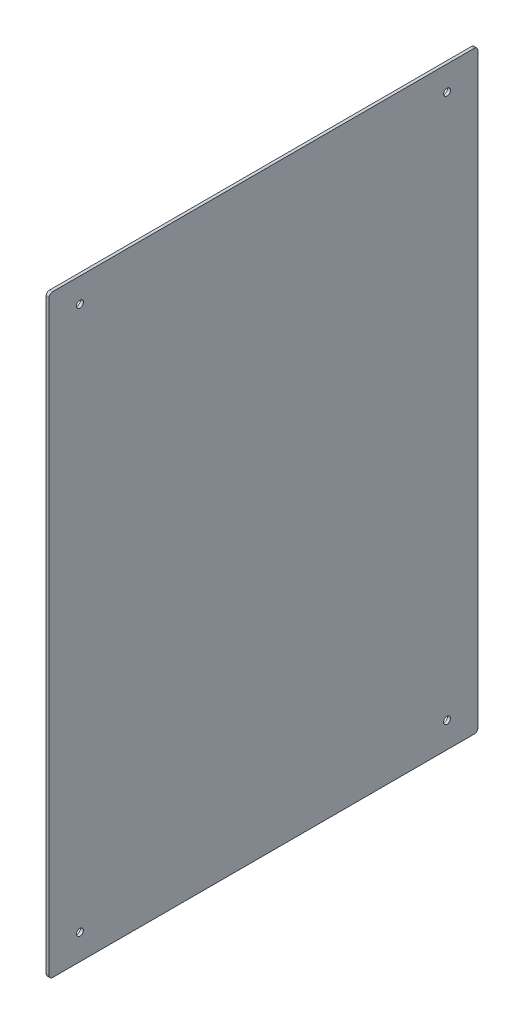
ISO-10303-21;
HEADER;
FILE_DESCRIPTION(('STEP AP214'),'2;1');
FILE_NAME('part.step','',(''),(''),'','','');
FILE_SCHEMA(('AUTOMOTIVE_DESIGN { 1 0 10303 214 1 1 1 1 }'));
ENDSEC;
DATA;
#1=APPLICATION_CONTEXT('core data for automotive mechanical design processes');
#2=APPLICATION_PROTOCOL_DEFINITION('international standard','automotive_design',2000,#1);
#3=PRODUCT_CONTEXT('',#1,'mechanical');
#4=PRODUCT('Part','Part','',(#3));
#5=PRODUCT_RELATED_PRODUCT_CATEGORY('part','',(#4));
#6=PRODUCT_DEFINITION_FORMATION('','',#4);
#7=PRODUCT_DEFINITION_CONTEXT('part definition',#1,'design');
#8=PRODUCT_DEFINITION('design','',#6,#7);
#9=PRODUCT_DEFINITION_SHAPE('','',#8);
#10=(LENGTH_UNIT() NAMED_UNIT(*) SI_UNIT(.MILLI.,.METRE.));
#11=(NAMED_UNIT(*) PLANE_ANGLE_UNIT() SI_UNIT($,.RADIAN.));
#12=(NAMED_UNIT(*) SI_UNIT($,.STERADIAN.) SOLID_ANGLE_UNIT());
#13=UNCERTAINTY_MEASURE_WITH_UNIT(LENGTH_MEASURE(1.E-05),#10,'distance_accuracy_value','');
#14=(GEOMETRIC_REPRESENTATION_CONTEXT(3) GLOBAL_UNCERTAINTY_ASSIGNED_CONTEXT((#13)) GLOBAL_UNIT_ASSIGNED_CONTEXT((#10,
#11,#12)) REPRESENTATION_CONTEXT('',''));
#15=CARTESIAN_POINT('',(0.,0.,0.));
#16=DIRECTION('',(0.,0.,1.));
#17=DIRECTION('',(1.,0.,0.));
#18=AXIS2_PLACEMENT_3D('',#15,#16,#17);
#19=CARTESIAN_POINT('',(1.3,0.,0.));
#20=DIRECTION('',(-1.,0.,0.));
#21=DIRECTION('',(0.,0.,1.));
#22=AXIS2_PLACEMENT_3D('',#19,#20,#21);
#23=PLANE('',#22);
#24=DIRECTION('',(0.,0.,-1.));
#25=VECTOR('',#24,1.);
#26=CARTESIAN_POINT('',(1.3,0.,0.));
#27=LINE('',#26,#25);
#28=CARTESIAN_POINT('',(1.3,0.,-1.5));
#29=VERTEX_POINT('',#28);
#30=CARTESIAN_POINT('',(1.3,0.,-186.5));
#31=VERTEX_POINT('',#30);
#32=EDGE_CURVE('E171',#29,#31,#27,.T.);
#33=ORIENTED_EDGE('',*,*,#32,.T.);
#34=CARTESIAN_POINT('',(1.3,1.5,-186.5));
#35=DIRECTION('',(-1.,0.,0.));
#36=DIRECTION('',(0.,0.,1.));
#37=AXIS2_PLACEMENT_3D('',#34,#35,#36);
#38=CIRCLE('',#37,1.5);
#39=CARTESIAN_POINT('',(1.3,1.5,-188.));
#40=VERTEX_POINT('',#39);
#41=EDGE_CURVE('E149',#31,#40,#38,.F.);
#42=ORIENTED_EDGE('',*,*,#41,.T.);
#43=DIRECTION('',(0.,1.,0.));
#44=VECTOR('',#43,1.);
#45=CARTESIAN_POINT('',(1.3,0.,-188.));
#46=LINE('',#45,#44);
#47=CARTESIAN_POINT('',(1.3,259.,-188.));
#48=VERTEX_POINT('',#47);
#49=EDGE_CURVE('E119',#40,#48,#46,.T.);
#50=ORIENTED_EDGE('',*,*,#49,.T.);
#51=CARTESIAN_POINT('',(1.3,259.,-186.5));
#52=DIRECTION('',(-1.,0.,0.));
#53=DIRECTION('',(0.,0.,1.));
#54=AXIS2_PLACEMENT_3D('',#51,#52,#53);
#55=CIRCLE('',#54,1.5);
#56=CARTESIAN_POINT('',(1.3,260.5,-186.5));
#57=VERTEX_POINT('',#56);
#58=EDGE_CURVE('E55',#48,#57,#55,.F.);
#59=ORIENTED_EDGE('',*,*,#58,.T.);
#60=DIRECTION('',(0.,0.,1.));
#61=VECTOR('',#60,1.);
#62=CARTESIAN_POINT('',(1.3,260.5,0.));
#63=LINE('',#62,#61);
#64=CARTESIAN_POINT('',(1.3,260.5,-1.5));
#65=VERTEX_POINT('',#64);
#66=EDGE_CURVE('E135',#57,#65,#63,.T.);
#67=ORIENTED_EDGE('',*,*,#66,.T.);
#68=CARTESIAN_POINT('',(1.3,259.,-1.5));
#69=DIRECTION('',(-1.,0.,0.));
#70=DIRECTION('',(0.,0.,1.));
#71=AXIS2_PLACEMENT_3D('',#68,#69,#70);
#72=CIRCLE('',#71,1.5);
#73=CARTESIAN_POINT('',(1.3,259.,0.));
#74=VERTEX_POINT('',#73);
#75=EDGE_CURVE('E145',#65,#74,#72,.F.);
#76=ORIENTED_EDGE('',*,*,#75,.T.);
#77=DIRECTION('',(0.,-1.,0.));
#78=VECTOR('',#77,1.);
#79=CARTESIAN_POINT('',(1.3,0.,0.));
#80=LINE('',#79,#78);
#81=CARTESIAN_POINT('',(1.3,1.5,0.));
#82=VERTEX_POINT('',#81);
#83=EDGE_CURVE('E129',#74,#82,#80,.T.);
#84=ORIENTED_EDGE('',*,*,#83,.T.);
#85=CARTESIAN_POINT('',(1.3,1.5,-1.5));
#86=DIRECTION('',(-1.,0.,0.));
#87=DIRECTION('',(0.,0.,1.));
#88=AXIS2_PLACEMENT_3D('',#85,#86,#87);
#89=CIRCLE('',#88,1.5);
#90=EDGE_CURVE('E147',#82,#29,#89,.F.);
#91=ORIENTED_EDGE('',*,*,#90,.T.);
#92=EDGE_LOOP('',(#33,#42,#50,#59,#67,#76,#84,#91));
#93=FACE_BOUND('',#92,.T.);
#94=CARTESIAN_POINT('',(1.3,249.8,-174.5));
#95=DIRECTION('',(1.,0.,0.));
#96=DIRECTION('',(0.,0.,-1.));
#97=AXIS2_PLACEMENT_3D('',#94,#95,#96);
#98=CIRCLE('',#97,1.5);
#99=CARTESIAN_POINT('',(1.3,249.8,-176.));
#100=VERTEX_POINT('',#99);
#101=EDGE_CURVE('E180',#100,#100,#98,.T.);
#102=ORIENTED_EDGE('',*,*,#101,.F.);
#103=EDGE_LOOP('',(#102));
#104=FACE_BOUND('',#103,.T.);
#105=CARTESIAN_POINT('',(1.3,11.2,-174.5));
#106=DIRECTION('',(1.,0.,0.));
#107=DIRECTION('',(0.,0.,-1.));
#108=AXIS2_PLACEMENT_3D('',#105,#106,#107);
#109=CIRCLE('',#108,1.5);
#110=CARTESIAN_POINT('',(1.3,11.2,-176.));
#111=VERTEX_POINT('',#110);
#112=EDGE_CURVE('E185',#111,#111,#109,.T.);
#113=ORIENTED_EDGE('',*,*,#112,.F.);
#114=EDGE_LOOP('',(#113));
#115=FACE_BOUND('',#114,.T.);
#116=CARTESIAN_POINT('',(1.3,249.8,-13.5));
#117=DIRECTION('',(1.,0.,0.));
#118=DIRECTION('',(0.,0.,-1.));
#119=AXIS2_PLACEMENT_3D('',#116,#117,#118);
#120=CIRCLE('',#119,1.5);
#121=CARTESIAN_POINT('',(1.3,249.8,-15.));
#122=VERTEX_POINT('',#121);
#123=EDGE_CURVE('E190',#122,#122,#120,.T.);
#124=ORIENTED_EDGE('',*,*,#123,.F.);
#125=EDGE_LOOP('',(#124));
#126=FACE_BOUND('',#125,.T.);
#127=CARTESIAN_POINT('',(1.3,11.2,-13.5));
#128=DIRECTION('',(1.,0.,0.));
#129=DIRECTION('',(0.,0.,-1.));
#130=AXIS2_PLACEMENT_3D('',#127,#128,#129);
#131=CIRCLE('',#130,1.5);
#132=CARTESIAN_POINT('',(1.3,11.2,-15.));
#133=VERTEX_POINT('',#132);
#134=EDGE_CURVE('E196',#133,#133,#131,.T.);
#135=ORIENTED_EDGE('',*,*,#134,.F.);
#136=EDGE_LOOP('',(#135));
#137=FACE_BOUND('',#136,.T.);
#138=ADVANCED_FACE('F35',(#93,#104,#115,#126,#137),#23,.F.);
#139=CARTESIAN_POINT('',(0.,0.,0.));
#140=DIRECTION('',(-1.,0.,0.));
#141=DIRECTION('',(0.,0.,1.));
#142=AXIS2_PLACEMENT_3D('',#139,#140,#141);
#143=PLANE('',#142);
#144=CARTESIAN_POINT('',(0.,249.8,-13.5));
#145=DIRECTION('',(1.,0.,0.));
#146=DIRECTION('',(0.,0.,-1.));
#147=AXIS2_PLACEMENT_3D('',#144,#145,#146);
#148=CIRCLE('',#147,1.5);
#149=CARTESIAN_POINT('',(0.,249.8,-15.));
#150=VERTEX_POINT('',#149);
#151=EDGE_CURVE('E193',#150,#150,#148,.T.);
#152=ORIENTED_EDGE('',*,*,#151,.T.);
#153=EDGE_LOOP('',(#152));
#154=FACE_BOUND('',#153,.T.);
#155=CARTESIAN_POINT('',(0.,249.8,-174.5));
#156=DIRECTION('',(1.,0.,0.));
#157=DIRECTION('',(0.,0.,-1.));
#158=AXIS2_PLACEMENT_3D('',#155,#156,#157);
#159=CIRCLE('',#158,1.5);
#160=CARTESIAN_POINT('',(0.,249.8,-176.));
#161=VERTEX_POINT('',#160);
#162=EDGE_CURVE('E176',#161,#161,#159,.T.);
#163=ORIENTED_EDGE('',*,*,#162,.T.);
#164=EDGE_LOOP('',(#163));
#165=FACE_BOUND('',#164,.T.);
#166=DIRECTION('',(0.,1.,0.));
#167=VECTOR('',#166,1.);
#168=CARTESIAN_POINT('',(0.,0.,-188.));
#169=LINE('',#168,#167);
#170=CARTESIAN_POINT('',(0.,1.5,-188.));
#171=VERTEX_POINT('',#170);
#172=CARTESIAN_POINT('',(0.,259.,-188.));
#173=VERTEX_POINT('',#172);
#174=EDGE_CURVE('E117',#171,#173,#169,.T.);
#175=ORIENTED_EDGE('',*,*,#174,.F.);
#176=CARTESIAN_POINT('',(0.,1.5,-186.5));
#177=DIRECTION('',(-1.,0.,0.));
#178=DIRECTION('',(0.,0.,1.));
#179=AXIS2_PLACEMENT_3D('',#176,#177,#178);
#180=CIRCLE('',#179,1.5);
#181=CARTESIAN_POINT('',(0.,0.,-186.5));
#182=VERTEX_POINT('',#181);
#183=EDGE_CURVE('E100',#171,#182,#180,.T.);
#184=ORIENTED_EDGE('',*,*,#183,.T.);
#185=DIRECTION('',(0.,0.,-1.));
#186=VECTOR('',#185,1.);
#187=CARTESIAN_POINT('',(0.,0.,0.));
#188=LINE('',#187,#186);
#189=CARTESIAN_POINT('',(0.,0.,-1.5));
#190=VERTEX_POINT('',#189);
#191=EDGE_CURVE('E127',#190,#182,#188,.T.);
#192=ORIENTED_EDGE('',*,*,#191,.F.);
#193=CARTESIAN_POINT('',(0.,1.5,-1.5));
#194=DIRECTION('',(-1.,0.,0.));
#195=DIRECTION('',(0.,0.,1.));
#196=AXIS2_PLACEMENT_3D('',#193,#194,#195);
#197=CIRCLE('',#196,1.5);
#198=CARTESIAN_POINT('',(0.,1.5,0.));
#199=VERTEX_POINT('',#198);
#200=EDGE_CURVE('E111',#190,#199,#197,.T.);
#201=ORIENTED_EDGE('',*,*,#200,.T.);
#202=DIRECTION('',(0.,-1.,0.));
#203=VECTOR('',#202,1.);
#204=CARTESIAN_POINT('',(0.,0.,0.));
#205=LINE('',#204,#203);
#206=CARTESIAN_POINT('',(0.,259.,0.));
#207=VERTEX_POINT('',#206);
#208=EDGE_CURVE('E131',#207,#199,#205,.T.);
#209=ORIENTED_EDGE('',*,*,#208,.F.);
#210=CARTESIAN_POINT('',(0.,259.,-1.5));
#211=DIRECTION('',(-1.,0.,0.));
#212=DIRECTION('',(0.,0.,1.));
#213=AXIS2_PLACEMENT_3D('',#210,#211,#212);
#214=CIRCLE('',#213,1.5);
#215=CARTESIAN_POINT('',(0.,260.5,-1.5));
#216=VERTEX_POINT('',#215);
#217=EDGE_CURVE('E138',#207,#216,#214,.T.);
#218=ORIENTED_EDGE('',*,*,#217,.T.);
#219=DIRECTION('',(0.,0.,1.));
#220=VECTOR('',#219,1.);
#221=CARTESIAN_POINT('',(0.,260.5,0.));
#222=LINE('',#221,#220);
#223=CARTESIAN_POINT('',(0.,260.5,-186.5));
#224=VERTEX_POINT('',#223);
#225=EDGE_CURVE('E126',#224,#216,#222,.T.);
#226=ORIENTED_EDGE('',*,*,#225,.F.);
#227=CARTESIAN_POINT('',(0.,259.,-186.5));
#228=DIRECTION('',(-1.,0.,0.));
#229=DIRECTION('',(0.,0.,1.));
#230=AXIS2_PLACEMENT_3D('',#227,#228,#229);
#231=CIRCLE('',#230,1.5);
#232=EDGE_CURVE('E120',#224,#173,#231,.T.);
#233=ORIENTED_EDGE('',*,*,#232,.T.);
#234=EDGE_LOOP('',(#175,#184,#192,#201,#209,#218,#226,#233));
#235=FACE_BOUND('',#234,.T.);
#236=CARTESIAN_POINT('',(0.,11.2,-174.5));
#237=DIRECTION('',(1.,0.,0.));
#238=DIRECTION('',(0.,0.,-1.));
#239=AXIS2_PLACEMENT_3D('',#236,#237,#238);
#240=CIRCLE('',#239,1.5);
#241=CARTESIAN_POINT('',(0.,11.2,-176.));
#242=VERTEX_POINT('',#241);
#243=EDGE_CURVE('E187',#242,#242,#240,.T.);
#244=ORIENTED_EDGE('',*,*,#243,.T.);
#245=EDGE_LOOP('',(#244));
#246=FACE_BOUND('',#245,.T.);
#247=CARTESIAN_POINT('',(0.,11.2,-13.5));
#248=DIRECTION('',(1.,0.,0.));
#249=DIRECTION('',(0.,0.,-1.));
#250=AXIS2_PLACEMENT_3D('',#247,#248,#249);
#251=CIRCLE('',#250,1.5);
#252=CARTESIAN_POINT('',(0.,11.2,-15.));
#253=VERTEX_POINT('',#252);
#254=EDGE_CURVE('E199',#253,#253,#251,.T.);
#255=ORIENTED_EDGE('',*,*,#254,.T.);
#256=EDGE_LOOP('',(#255));
#257=FACE_BOUND('',#256,.T.);
#258=ADVANCED_FACE('F123',(#154,#165,#235,#246,#257),#143,.T.);
#259=CARTESIAN_POINT('',(1.3,0.,0.));
#260=DIRECTION('',(0.,0.,-1.));
#261=DIRECTION('',(-1.,0.,0.));
#262=AXIS2_PLACEMENT_3D('',#259,#260,#261);
#263=PLANE('',#262);
#264=ORIENTED_EDGE('',*,*,#208,.T.);
#265=DIRECTION('',(-1.,0.,0.));
#266=VECTOR('',#265,1.);
#267=CARTESIAN_POINT('',(1.3,1.5,0.));
#268=LINE('',#267,#266);
#269=EDGE_CURVE('E154',#199,#82,#268,.F.);
#270=ORIENTED_EDGE('',*,*,#269,.T.);
#271=ORIENTED_EDGE('',*,*,#83,.F.);
#272=DIRECTION('',(-1.,0.,0.));
#273=VECTOR('',#272,1.);
#274=CARTESIAN_POINT('',(1.3,259.,0.));
#275=LINE('',#274,#273);
#276=EDGE_CURVE('E151',#74,#207,#275,.T.);
#277=ORIENTED_EDGE('',*,*,#276,.T.);
#278=EDGE_LOOP('',(#264,#270,#271,#277));
#279=FACE_BOUND('',#278,.T.);
#280=ADVANCED_FACE('F167',(#279),#263,.F.);
#281=CARTESIAN_POINT('',(1.3,0.,0.));
#282=DIRECTION('',(0.,1.,0.));
#283=DIRECTION('',(0.,0.,1.));
#284=AXIS2_PLACEMENT_3D('',#281,#282,#283);
#285=PLANE('',#284);
#286=ORIENTED_EDGE('',*,*,#191,.T.);
#287=DIRECTION('',(-1.,0.,0.));
#288=VECTOR('',#287,1.);
#289=CARTESIAN_POINT('',(1.3,0.,-186.5));
#290=LINE('',#289,#288);
#291=EDGE_CURVE('E105',#182,#31,#290,.F.);
#292=ORIENTED_EDGE('',*,*,#291,.T.);
#293=ORIENTED_EDGE('',*,*,#32,.F.);
#294=DIRECTION('',(-1.,0.,0.));
#295=VECTOR('',#294,1.);
#296=CARTESIAN_POINT('',(1.3,0.,-1.5));
#297=LINE('',#296,#295);
#298=EDGE_CURVE('E110',#29,#190,#297,.T.);
#299=ORIENTED_EDGE('',*,*,#298,.T.);
#300=EDGE_LOOP('',(#286,#292,#293,#299));
#301=FACE_BOUND('',#300,.T.);
#302=ADVANCED_FACE('F224',(#301),#285,.F.);
#303=CARTESIAN_POINT('',(1.3,0.,-188.));
#304=DIRECTION('',(0.,0.,1.));
#305=DIRECTION('',(1.,0.,0.));
#306=AXIS2_PLACEMENT_3D('',#303,#304,#305);
#307=PLANE('',#306);
#308=ORIENTED_EDGE('',*,*,#49,.F.);
#309=DIRECTION('',(-1.,0.,0.));
#310=VECTOR('',#309,1.);
#311=CARTESIAN_POINT('',(1.3,1.5,-188.));
#312=LINE('',#311,#310);
#313=EDGE_CURVE('E104',#40,#171,#312,.T.);
#314=ORIENTED_EDGE('',*,*,#313,.T.);
#315=ORIENTED_EDGE('',*,*,#174,.T.);
#316=DIRECTION('',(-1.,0.,0.));
#317=VECTOR('',#316,1.);
#318=CARTESIAN_POINT('',(1.3,259.,-188.));
#319=LINE('',#318,#317);
#320=EDGE_CURVE('E121',#173,#48,#319,.F.);
#321=ORIENTED_EDGE('',*,*,#320,.T.);
#322=EDGE_LOOP('',(#308,#314,#315,#321));
#323=FACE_BOUND('',#322,.T.);
#324=ADVANCED_FACE('F116',(#323),#307,.F.);
#325=CARTESIAN_POINT('',(1.3,260.5,0.));
#326=DIRECTION('',(0.,-1.,0.));
#327=DIRECTION('',(0.,0.,-1.));
#328=AXIS2_PLACEMENT_3D('',#325,#326,#327);
#329=PLANE('',#328);
#330=ORIENTED_EDGE('',*,*,#225,.T.);
#331=DIRECTION('',(-1.,0.,0.));
#332=VECTOR('',#331,1.);
#333=CARTESIAN_POINT('',(1.3,260.5,-1.5));
#334=LINE('',#333,#332);
#335=EDGE_CURVE('E11',#216,#65,#334,.F.);
#336=ORIENTED_EDGE('',*,*,#335,.T.);
#337=ORIENTED_EDGE('',*,*,#66,.F.);
#338=DIRECTION('',(-1.,0.,0.));
#339=VECTOR('',#338,1.);
#340=CARTESIAN_POINT('',(1.3,260.5,-186.5));
#341=LINE('',#340,#339);
#342=EDGE_CURVE('E43',#57,#224,#341,.T.);
#343=ORIENTED_EDGE('',*,*,#342,.T.);
#344=EDGE_LOOP('',(#330,#336,#337,#343));
#345=FACE_BOUND('',#344,.T.);
#346=ADVANCED_FACE('F157',(#345),#329,.F.);
#347=CARTESIAN_POINT('',(1.3,249.8,-174.5));
#348=DIRECTION('',(-1.,0.,0.));
#349=DIRECTION('',(0.,0.,1.));
#350=AXIS2_PLACEMENT_3D('',#347,#348,#349);
#351=CYLINDRICAL_SURFACE('',#350,1.5);
#352=ORIENTED_EDGE('',*,*,#101,.T.);
#353=EDGE_LOOP('',(#352));
#354=FACE_BOUND('',#353,.T.);
#355=ORIENTED_EDGE('',*,*,#162,.F.);
#356=EDGE_LOOP('',(#355));
#357=FACE_BOUND('',#356,.T.);
#358=ADVANCED_FACE('F217',(#354,#357),#351,.F.);
#359=CARTESIAN_POINT('',(1.3,11.2,-174.5));
#360=DIRECTION('',(-1.,0.,0.));
#361=DIRECTION('',(0.,0.,1.));
#362=AXIS2_PLACEMENT_3D('',#359,#360,#361);
#363=CYLINDRICAL_SURFACE('',#362,1.5);
#364=ORIENTED_EDGE('',*,*,#112,.T.);
#365=EDGE_LOOP('',(#364));
#366=FACE_BOUND('',#365,.T.);
#367=ORIENTED_EDGE('',*,*,#243,.F.);
#368=EDGE_LOOP('',(#367));
#369=FACE_BOUND('',#368,.T.);
#370=ADVANCED_FACE('F313',(#366,#369),#363,.F.);
#371=CARTESIAN_POINT('',(1.3,249.8,-13.5));
#372=DIRECTION('',(-1.,0.,0.));
#373=DIRECTION('',(0.,0.,1.));
#374=AXIS2_PLACEMENT_3D('',#371,#372,#373);
#375=CYLINDRICAL_SURFACE('',#374,1.5);
#376=ORIENTED_EDGE('',*,*,#123,.T.);
#377=EDGE_LOOP('',(#376));
#378=FACE_BOUND('',#377,.T.);
#379=ORIENTED_EDGE('',*,*,#151,.F.);
#380=EDGE_LOOP('',(#379));
#381=FACE_BOUND('',#380,.T.);
#382=ADVANCED_FACE('F304',(#378,#381),#375,.F.);
#383=CARTESIAN_POINT('',(1.3,11.2,-13.5));
#384=DIRECTION('',(-1.,0.,0.));
#385=DIRECTION('',(0.,0.,1.));
#386=AXIS2_PLACEMENT_3D('',#383,#384,#385);
#387=CYLINDRICAL_SURFACE('',#386,1.5);
#388=ORIENTED_EDGE('',*,*,#134,.T.);
#389=EDGE_LOOP('',(#388));
#390=FACE_BOUND('',#389,.T.);
#391=ORIENTED_EDGE('',*,*,#254,.F.);
#392=EDGE_LOOP('',(#391));
#393=FACE_BOUND('',#392,.T.);
#394=ADVANCED_FACE('F205',(#390,#393),#387,.F.);
#395=CARTESIAN_POINT('',(1.3,1.5,-186.5));
#396=DIRECTION('',(-1.,0.,0.));
#397=DIRECTION('',(0.,0.,1.));
#398=AXIS2_PLACEMENT_3D('',#395,#396,#397);
#399=CYLINDRICAL_SURFACE('',#398,1.5);
#400=ORIENTED_EDGE('',*,*,#41,.F.);
#401=ORIENTED_EDGE('',*,*,#291,.F.);
#402=ORIENTED_EDGE('',*,*,#183,.F.);
#403=ORIENTED_EDGE('',*,*,#313,.F.);
#404=EDGE_LOOP('',(#400,#401,#402,#403));
#405=FACE_BOUND('',#404,.T.);
#406=ADVANCED_FACE('F103',(#405),#399,.T.);
#407=CARTESIAN_POINT('',(1.3,1.5,-1.5));
#408=DIRECTION('',(-1.,0.,0.));
#409=DIRECTION('',(0.,0.,1.));
#410=AXIS2_PLACEMENT_3D('',#407,#408,#409);
#411=CYLINDRICAL_SURFACE('',#410,1.5);
#412=ORIENTED_EDGE('',*,*,#90,.F.);
#413=ORIENTED_EDGE('',*,*,#269,.F.);
#414=ORIENTED_EDGE('',*,*,#200,.F.);
#415=ORIENTED_EDGE('',*,*,#298,.F.);
#416=EDGE_LOOP('',(#412,#413,#414,#415));
#417=FACE_BOUND('',#416,.T.);
#418=ADVANCED_FACE('F232',(#417),#411,.T.);
#419=CARTESIAN_POINT('',(1.3,259.,-1.5));
#420=DIRECTION('',(-1.,0.,0.));
#421=DIRECTION('',(0.,0.,1.));
#422=AXIS2_PLACEMENT_3D('',#419,#420,#421);
#423=CYLINDRICAL_SURFACE('',#422,1.5);
#424=ORIENTED_EDGE('',*,*,#75,.F.);
#425=ORIENTED_EDGE('',*,*,#335,.F.);
#426=ORIENTED_EDGE('',*,*,#217,.F.);
#427=ORIENTED_EDGE('',*,*,#276,.F.);
#428=EDGE_LOOP('',(#424,#425,#426,#427));
#429=FACE_BOUND('',#428,.T.);
#430=ADVANCED_FACE('F164',(#429),#423,.T.);
#431=CARTESIAN_POINT('',(1.3,259.,-186.5));
#432=DIRECTION('',(-1.,0.,0.));
#433=DIRECTION('',(0.,0.,1.));
#434=AXIS2_PLACEMENT_3D('',#431,#432,#433);
#435=CYLINDRICAL_SURFACE('',#434,1.5);
#436=ORIENTED_EDGE('',*,*,#58,.F.);
#437=ORIENTED_EDGE('',*,*,#320,.F.);
#438=ORIENTED_EDGE('',*,*,#232,.F.);
#439=ORIENTED_EDGE('',*,*,#342,.F.);
#440=EDGE_LOOP('',(#436,#437,#438,#439));
#441=FACE_BOUND('',#440,.T.);
#442=ADVANCED_FACE('F37',(#441),#435,.T.);
#443=CLOSED_SHELL('',(#138,#258,#280,#302,#324,#346,#358,#370,#382,#394,#406,#418,#430,#442));
#444=MANIFOLD_SOLID_BREP('B2',#443);
#445=ADVANCED_BREP_SHAPE_REPRESENTATION('',(#18,#444),#14);
#446=SHAPE_DEFINITION_REPRESENTATION(#9,#445);
ENDSEC;
END-ISO-10303-21;
